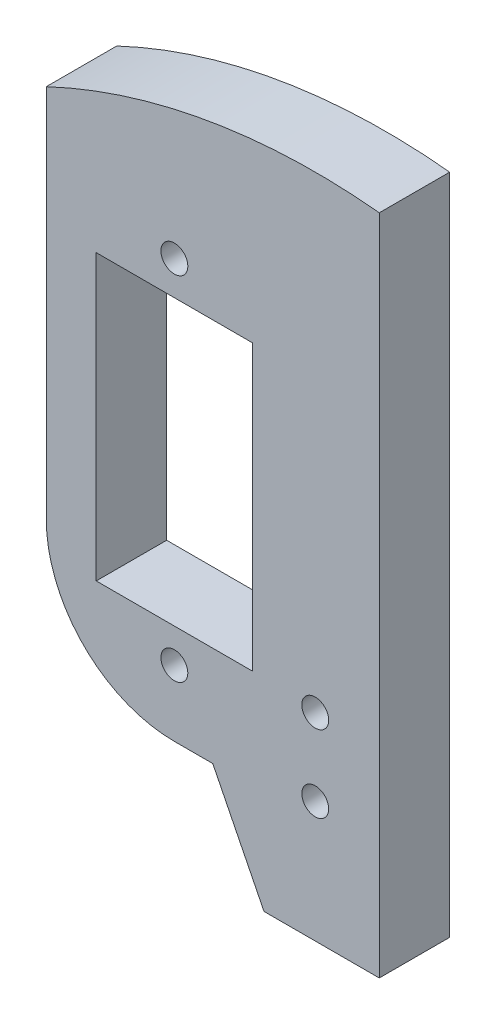
ISO-10303-21;
HEADER;
FILE_DESCRIPTION(('STEP AP214'),'2;1');
FILE_NAME('part.step','',(''),(''),'','','');
FILE_SCHEMA(('AUTOMOTIVE_DESIGN { 1 0 10303 214 1 1 1 1 }'));
ENDSEC;
DATA;
#1=APPLICATION_CONTEXT('core data for automotive mechanical design processes');
#2=APPLICATION_PROTOCOL_DEFINITION('international standard','automotive_design',2000,#1);
#3=PRODUCT_CONTEXT('',#1,'mechanical');
#4=PRODUCT('Part','Part','',(#3));
#5=PRODUCT_RELATED_PRODUCT_CATEGORY('part','',(#4));
#6=PRODUCT_DEFINITION_FORMATION('','',#4);
#7=PRODUCT_DEFINITION_CONTEXT('part definition',#1,'design');
#8=PRODUCT_DEFINITION('design','',#6,#7);
#9=PRODUCT_DEFINITION_SHAPE('','',#8);
#10=(LENGTH_UNIT() NAMED_UNIT(*) SI_UNIT(.MILLI.,.METRE.));
#11=(NAMED_UNIT(*) PLANE_ANGLE_UNIT() SI_UNIT($,.RADIAN.));
#12=(NAMED_UNIT(*) SI_UNIT($,.STERADIAN.) SOLID_ANGLE_UNIT());
#13=UNCERTAINTY_MEASURE_WITH_UNIT(LENGTH_MEASURE(1.E-05),#10,'distance_accuracy_value','');
#14=(GEOMETRIC_REPRESENTATION_CONTEXT(3) GLOBAL_UNCERTAINTY_ASSIGNED_CONTEXT((#13)) GLOBAL_UNIT_ASSIGNED_CONTEXT((#10,
#11,#12)) REPRESENTATION_CONTEXT('',''));
#15=CARTESIAN_POINT('',(0.,0.,0.));
#16=DIRECTION('',(0.,0.,1.));
#17=DIRECTION('',(1.,0.,0.));
#18=AXIS2_PLACEMENT_3D('',#15,#16,#17);
#19=CARTESIAN_POINT('',(0.,0.,5.5));
#20=DIRECTION('',(0.,0.,1.));
#21=DIRECTION('',(1.,0.,0.));
#22=AXIS2_PLACEMENT_3D('',#19,#20,#21);
#23=PLANE('',#22);
#24=DIRECTION('',(0.,-1.,0.));
#25=VECTOR('',#24,1.);
#26=CARTESIAN_POINT('',(-10.,26.1,5.5));
#27=LINE('',#26,#25);
#28=CARTESIAN_POINT('',(-10.,20.3718872423573,5.5));
#29=VERTEX_POINT('',#28);
#30=CARTESIAN_POINT('',(-10.,-8.89999999999999,5.5));
#31=VERTEX_POINT('',#30);
#32=EDGE_CURVE('E139',#29,#31,#27,.T.);
#33=ORIENTED_EDGE('',*,*,#32,.T.);
#34=CARTESIAN_POINT('',(0.,-8.9,5.5));
#35=DIRECTION('',(0.,0.,1.));
#36=DIRECTION('',(1.,0.,0.));
#37=AXIS2_PLACEMENT_3D('',#34,#35,#36);
#38=CIRCLE('',#37,10.);
#39=CARTESIAN_POINT('',(0.,-18.9,5.5));
#40=VERTEX_POINT('',#39);
#41=EDGE_CURVE('E11',#31,#40,#38,.T.);
#42=ORIENTED_EDGE('',*,*,#41,.T.);
#43=DIRECTION('',(1.,0.,0.));
#44=VECTOR('',#43,1.);
#45=CARTESIAN_POINT('',(-10.,-18.9,5.5));
#46=LINE('',#45,#44);
#47=CARTESIAN_POINT('',(3.,-18.9,5.5));
#48=VERTEX_POINT('',#47);
#49=EDGE_CURVE('E142',#40,#48,#46,.T.);
#50=ORIENTED_EDGE('',*,*,#49,.T.);
#51=DIRECTION('',(0.447213595499959,-0.894427190999916,0.));
#52=VECTOR('',#51,1.);
#53=CARTESIAN_POINT('',(3.,-18.9,5.5));
#54=LINE('',#53,#52);
#55=CARTESIAN_POINT('',(7.00000000000001,-26.9,5.5));
#56=VERTEX_POINT('',#55);
#57=EDGE_CURVE('E175',#48,#56,#54,.T.);
#58=ORIENTED_EDGE('',*,*,#57,.T.);
#59=DIRECTION('',(1.,0.,0.));
#60=VECTOR('',#59,1.);
#61=CARTESIAN_POINT('',(7.00000000000001,-26.9,5.5));
#62=LINE('',#61,#60);
#63=CARTESIAN_POINT('',(16.,-26.9,5.5));
#64=VERTEX_POINT('',#63);
#65=EDGE_CURVE('E173',#56,#64,#62,.T.);
#66=ORIENTED_EDGE('',*,*,#65,.T.);
#67=DIRECTION('',(0.,1.,0.));
#68=VECTOR('',#67,1.);
#69=CARTESIAN_POINT('',(16.,26.1,5.5));
#70=LINE('',#69,#68);
#71=CARTESIAN_POINT('',(16.,24.8442304278158,5.5));
#72=VERTEX_POINT('',#71);
#73=EDGE_CURVE('E150',#64,#72,#70,.T.);
#74=ORIENTED_EDGE('',*,*,#73,.T.);
#75=CARTESIAN_POINT('',(11.,-23.9,5.5));
#76=DIRECTION('',(0.,0.,-1.));
#77=DIRECTION('',(-1.,0.,0.));
#78=AXIS2_PLACEMENT_3D('',#75,#76,#77);
#79=CIRCLE('',#78,49.);
#80=EDGE_CURVE('E121',#29,#72,#79,.T.);
#81=ORIENTED_EDGE('',*,*,#80,.F.);
#82=EDGE_LOOP('',(#33,#42,#50,#58,#66,#74,#81));
#83=FACE_BOUND('',#82,.T.);
#84=CARTESIAN_POINT('',(11.,-11.45,5.5));
#85=DIRECTION('',(0.,0.,1.));
#86=DIRECTION('',(1.,0.,0.));
#87=AXIS2_PLACEMENT_3D('',#84,#85,#86);
#88=CIRCLE('',#87,1.05);
#89=CARTESIAN_POINT('',(12.05,-11.45,5.5));
#90=VERTEX_POINT('',#89);
#91=EDGE_CURVE('E218',#90,#90,#88,.T.);
#92=ORIENTED_EDGE('',*,*,#91,.F.);
#93=EDGE_LOOP('',(#92));
#94=FACE_BOUND('',#93,.T.);
#95=CARTESIAN_POINT('',(0.,-13.75,5.5));
#96=DIRECTION('',(0.,0.,1.));
#97=DIRECTION('',(1.,0.,0.));
#98=AXIS2_PLACEMENT_3D('',#95,#96,#97);
#99=CIRCLE('',#98,1.05);
#100=CARTESIAN_POINT('',(1.05,-13.75,5.5));
#101=VERTEX_POINT('',#100);
#102=EDGE_CURVE('E201',#101,#101,#99,.T.);
#103=ORIENTED_EDGE('',*,*,#102,.F.);
#104=EDGE_LOOP('',(#103));
#105=FACE_BOUND('',#104,.T.);
#106=DIRECTION('',(1.,0.,0.));
#107=VECTOR('',#106,1.);
#108=CARTESIAN_POINT('',(6.1,-11.1,5.5));
#109=LINE('',#108,#107);
#110=CARTESIAN_POINT('',(-6.1,-11.1,5.5));
#111=VERTEX_POINT('',#110);
#112=CARTESIAN_POINT('',(6.1,-11.1,5.5));
#113=VERTEX_POINT('',#112);
#114=EDGE_CURVE('E206',#111,#113,#109,.T.);
#115=ORIENTED_EDGE('',*,*,#114,.F.);
#116=DIRECTION('',(0.,-1.,0.));
#117=VECTOR('',#116,1.);
#118=CARTESIAN_POINT('',(-6.1,11.1,5.5));
#119=LINE('',#118,#117);
#120=CARTESIAN_POINT('',(-6.1,11.1,5.5));
#121=VERTEX_POINT('',#120);
#122=EDGE_CURVE('E191',#121,#111,#119,.T.);
#123=ORIENTED_EDGE('',*,*,#122,.F.);
#124=DIRECTION('',(-1.,0.,0.));
#125=VECTOR('',#124,1.);
#126=CARTESIAN_POINT('',(6.1,11.1,5.5));
#127=LINE('',#126,#125);
#128=CARTESIAN_POINT('',(6.1,11.1,5.5));
#129=VERTEX_POINT('',#128);
#130=EDGE_CURVE('E187',#129,#121,#127,.T.);
#131=ORIENTED_EDGE('',*,*,#130,.F.);
#132=DIRECTION('',(0.,1.,0.));
#133=VECTOR('',#132,1.);
#134=CARTESIAN_POINT('',(6.1,11.1,5.5));
#135=LINE('',#134,#133);
#136=EDGE_CURVE('E203',#113,#129,#135,.T.);
#137=ORIENTED_EDGE('',*,*,#136,.F.);
#138=EDGE_LOOP('',(#115,#123,#131,#137));
#139=FACE_BOUND('',#138,.T.);
#140=CARTESIAN_POINT('',(0.,13.75,5.5));
#141=DIRECTION('',(0.,0.,1.));
#142=DIRECTION('',(1.,0.,0.));
#143=AXIS2_PLACEMENT_3D('',#140,#141,#142);
#144=CIRCLE('',#143,1.05);
#145=CARTESIAN_POINT('',(1.05,13.75,5.5));
#146=VERTEX_POINT('',#145);
#147=EDGE_CURVE('E212',#146,#146,#144,.T.);
#148=ORIENTED_EDGE('',*,*,#147,.F.);
#149=EDGE_LOOP('',(#148));
#150=FACE_BOUND('',#149,.T.);
#151=CARTESIAN_POINT('',(11.,-17.45,5.5));
#152=DIRECTION('',(0.,0.,1.));
#153=DIRECTION('',(1.,0.,0.));
#154=AXIS2_PLACEMENT_3D('',#151,#152,#153);
#155=CIRCLE('',#154,1.05);
#156=CARTESIAN_POINT('',(12.05,-17.45,5.5));
#157=VERTEX_POINT('',#156);
#158=EDGE_CURVE('E224',#157,#157,#155,.T.);
#159=ORIENTED_EDGE('',*,*,#158,.F.);
#160=EDGE_LOOP('',(#159));
#161=FACE_BOUND('',#160,.T.);
#162=ADVANCED_FACE('F33',(#83,#94,#105,#139,#150,#161),#23,.T.);
#163=CARTESIAN_POINT('',(0.,0.,0.));
#164=DIRECTION('',(0.,0.,1.));
#165=DIRECTION('',(1.,0.,0.));
#166=AXIS2_PLACEMENT_3D('',#163,#164,#165);
#167=PLANE('',#166);
#168=DIRECTION('',(1.,0.,0.));
#169=VECTOR('',#168,1.);
#170=CARTESIAN_POINT('',(-10.,-18.9,0.));
#171=LINE('',#170,#169);
#172=CARTESIAN_POINT('',(0.,-18.9,0.));
#173=VERTEX_POINT('',#172);
#174=CARTESIAN_POINT('',(3.,-18.9,0.));
#175=VERTEX_POINT('',#174);
#176=EDGE_CURVE('E164',#173,#175,#171,.T.);
#177=ORIENTED_EDGE('',*,*,#176,.F.);
#178=CARTESIAN_POINT('',(0.,-8.9,0.));
#179=DIRECTION('',(0.,0.,1.));
#180=DIRECTION('',(1.,0.,0.));
#181=AXIS2_PLACEMENT_3D('',#178,#179,#180);
#182=CIRCLE('',#181,10.);
#183=CARTESIAN_POINT('',(-10.,-8.89999999999999,0.));
#184=VERTEX_POINT('',#183);
#185=EDGE_CURVE('E55',#173,#184,#182,.F.);
#186=ORIENTED_EDGE('',*,*,#185,.T.);
#187=DIRECTION('',(0.,-1.,0.));
#188=VECTOR('',#187,1.);
#189=CARTESIAN_POINT('',(-10.,26.1,0.));
#190=LINE('',#189,#188);
#191=CARTESIAN_POINT('',(-10.,20.3718872423573,0.));
#192=VERTEX_POINT('',#191);
#193=EDGE_CURVE('E133',#192,#184,#190,.T.);
#194=ORIENTED_EDGE('',*,*,#193,.F.);
#195=CARTESIAN_POINT('',(11.,-23.9,0.));
#196=DIRECTION('',(0.,0.,-1.));
#197=DIRECTION('',(-1.,0.,0.));
#198=AXIS2_PLACEMENT_3D('',#195,#196,#197);
#199=CIRCLE('',#198,49.);
#200=CARTESIAN_POINT('',(16.,24.8442304278158,0.));
#201=VERTEX_POINT('',#200);
#202=EDGE_CURVE('E118',#192,#201,#199,.T.);
#203=ORIENTED_EDGE('',*,*,#202,.T.);
#204=DIRECTION('',(0.,1.,0.));
#205=VECTOR('',#204,1.);
#206=CARTESIAN_POINT('',(16.,26.1,0.));
#207=LINE('',#206,#205);
#208=CARTESIAN_POINT('',(16.,-26.9,0.));
#209=VERTEX_POINT('',#208);
#210=EDGE_CURVE('E132',#209,#201,#207,.T.);
#211=ORIENTED_EDGE('',*,*,#210,.F.);
#212=DIRECTION('',(1.,0.,0.));
#213=VECTOR('',#212,1.);
#214=CARTESIAN_POINT('',(7.00000000000001,-26.9,0.));
#215=LINE('',#214,#213);
#216=CARTESIAN_POINT('',(7.00000000000001,-26.9,0.));
#217=VERTEX_POINT('',#216);
#218=EDGE_CURVE('E140',#217,#209,#215,.T.);
#219=ORIENTED_EDGE('',*,*,#218,.F.);
#220=DIRECTION('',(0.447213595499959,-0.894427190999916,0.));
#221=VECTOR('',#220,1.);
#222=CARTESIAN_POINT('',(3.,-18.9,0.));
#223=LINE('',#222,#221);
#224=EDGE_CURVE('E144',#175,#217,#223,.T.);
#225=ORIENTED_EDGE('',*,*,#224,.F.);
#226=EDGE_LOOP('',(#177,#186,#194,#203,#211,#219,#225));
#227=FACE_BOUND('',#226,.T.);
#228=DIRECTION('',(0.,-1.,0.));
#229=VECTOR('',#228,1.);
#230=CARTESIAN_POINT('',(-6.1,11.1,0.));
#231=LINE('',#230,#229);
#232=CARTESIAN_POINT('',(-6.1,11.1,0.));
#233=VERTEX_POINT('',#232);
#234=CARTESIAN_POINT('',(-6.1,-11.1,0.));
#235=VERTEX_POINT('',#234);
#236=EDGE_CURVE('E198',#233,#235,#231,.T.);
#237=ORIENTED_EDGE('',*,*,#236,.T.);
#238=DIRECTION('',(1.,0.,0.));
#239=VECTOR('',#238,1.);
#240=CARTESIAN_POINT('',(6.1,-11.1,0.));
#241=LINE('',#240,#239);
#242=CARTESIAN_POINT('',(6.1,-11.1,0.));
#243=VERTEX_POINT('',#242);
#244=EDGE_CURVE('E195',#235,#243,#241,.T.);
#245=ORIENTED_EDGE('',*,*,#244,.T.);
#246=DIRECTION('',(0.,1.,0.));
#247=VECTOR('',#246,1.);
#248=CARTESIAN_POINT('',(6.1,11.1,0.));
#249=LINE('',#248,#247);
#250=CARTESIAN_POINT('',(6.1,11.1,0.));
#251=VERTEX_POINT('',#250);
#252=EDGE_CURVE('E192',#243,#251,#249,.T.);
#253=ORIENTED_EDGE('',*,*,#252,.T.);
#254=DIRECTION('',(-1.,0.,0.));
#255=VECTOR('',#254,1.);
#256=CARTESIAN_POINT('',(6.1,11.1,0.));
#257=LINE('',#256,#255);
#258=EDGE_CURVE('E188',#251,#233,#257,.T.);
#259=ORIENTED_EDGE('',*,*,#258,.T.);
#260=EDGE_LOOP('',(#237,#245,#253,#259));
#261=FACE_BOUND('',#260,.T.);
#262=CARTESIAN_POINT('',(0.,-13.75,0.));
#263=DIRECTION('',(0.,0.,1.));
#264=DIRECTION('',(1.,0.,0.));
#265=AXIS2_PLACEMENT_3D('',#262,#263,#264);
#266=CIRCLE('',#265,1.05);
#267=CARTESIAN_POINT('',(1.05,-13.75,0.));
#268=VERTEX_POINT('',#267);
#269=EDGE_CURVE('E209',#268,#268,#266,.T.);
#270=ORIENTED_EDGE('',*,*,#269,.T.);
#271=EDGE_LOOP('',(#270));
#272=FACE_BOUND('',#271,.T.);
#273=CARTESIAN_POINT('',(0.,13.75,0.));
#274=DIRECTION('',(0.,0.,1.));
#275=DIRECTION('',(1.,0.,0.));
#276=AXIS2_PLACEMENT_3D('',#273,#274,#275);
#277=CIRCLE('',#276,1.05);
#278=CARTESIAN_POINT('',(1.05,13.75,0.));
#279=VERTEX_POINT('',#278);
#280=EDGE_CURVE('E215',#279,#279,#277,.T.);
#281=ORIENTED_EDGE('',*,*,#280,.T.);
#282=EDGE_LOOP('',(#281));
#283=FACE_BOUND('',#282,.T.);
#284=CARTESIAN_POINT('',(11.,-11.45,0.));
#285=DIRECTION('',(0.,0.,1.));
#286=DIRECTION('',(1.,0.,0.));
#287=AXIS2_PLACEMENT_3D('',#284,#285,#286);
#288=CIRCLE('',#287,1.05);
#289=CARTESIAN_POINT('',(12.05,-11.45,0.));
#290=VERTEX_POINT('',#289);
#291=EDGE_CURVE('E221',#290,#290,#288,.T.);
#292=ORIENTED_EDGE('',*,*,#291,.T.);
#293=EDGE_LOOP('',(#292));
#294=FACE_BOUND('',#293,.T.);
#295=CARTESIAN_POINT('',(11.,-17.45,0.));
#296=DIRECTION('',(0.,0.,1.));
#297=DIRECTION('',(1.,0.,0.));
#298=AXIS2_PLACEMENT_3D('',#295,#296,#297);
#299=CIRCLE('',#298,1.05);
#300=CARTESIAN_POINT('',(12.05,-17.45,0.));
#301=VERTEX_POINT('',#300);
#302=EDGE_CURVE('E227',#301,#301,#299,.T.);
#303=ORIENTED_EDGE('',*,*,#302,.T.);
#304=EDGE_LOOP('',(#303));
#305=FACE_BOUND('',#304,.T.);
#306=ADVANCED_FACE('F129',(#227,#261,#272,#283,#294,#305),#167,.F.);
#307=CARTESIAN_POINT('',(-10.,26.1,5.5));
#308=DIRECTION('',(1.,0.,0.));
#309=DIRECTION('',(0.,1.,0.));
#310=AXIS2_PLACEMENT_3D('',#307,#308,#309);
#311=PLANE('',#310);
#312=ORIENTED_EDGE('',*,*,#193,.T.);
#313=DIRECTION('',(0.,0.,-1.));
#314=VECTOR('',#313,1.);
#315=CARTESIAN_POINT('',(-10.,-8.9,5.5));
#316=LINE('',#315,#314);
#317=EDGE_CURVE('E41',#184,#31,#316,.F.);
#318=ORIENTED_EDGE('',*,*,#317,.T.);
#319=ORIENTED_EDGE('',*,*,#32,.F.);
#320=DIRECTION('',(0.,0.,1.));
#321=VECTOR('',#320,1.);
#322=CARTESIAN_POINT('',(-10.,20.3718872423573,0.));
#323=LINE('',#322,#321);
#324=EDGE_CURVE('E126',#192,#29,#323,.T.);
#325=ORIENTED_EDGE('',*,*,#324,.F.);
#326=EDGE_LOOP('',(#312,#318,#319,#325));
#327=FACE_BOUND('',#326,.T.);
#328=ADVANCED_FACE('F235',(#327),#311,.F.);
#329=CARTESIAN_POINT('',(-10.,-18.9,5.5));
#330=DIRECTION('',(0.,1.,0.));
#331=DIRECTION('',(0.,0.,1.));
#332=AXIS2_PLACEMENT_3D('',#329,#330,#331);
#333=PLANE('',#332);
#334=ORIENTED_EDGE('',*,*,#49,.F.);
#335=DIRECTION('',(0.,0.,-1.));
#336=VECTOR('',#335,1.);
#337=CARTESIAN_POINT('',(0.,-18.9,5.5));
#338=LINE('',#337,#336);
#339=EDGE_CURVE('E156',#40,#173,#338,.T.);
#340=ORIENTED_EDGE('',*,*,#339,.T.);
#341=ORIENTED_EDGE('',*,*,#176,.T.);
#342=DIRECTION('',(0.,0.,-1.));
#343=VECTOR('',#342,1.);
#344=CARTESIAN_POINT('',(3.,-18.9,5.5));
#345=LINE('',#344,#343);
#346=EDGE_CURVE('E153',#48,#175,#345,.T.);
#347=ORIENTED_EDGE('',*,*,#346,.F.);
#348=EDGE_LOOP('',(#334,#340,#341,#347));
#349=FACE_BOUND('',#348,.T.);
#350=ADVANCED_FACE('F162',(#349),#333,.F.);
#351=CARTESIAN_POINT('',(3.,-18.9,5.5));
#352=DIRECTION('',(0.894427190999916,0.447213595499959,0.));
#353=DIRECTION('',(-0.447213595499959,0.894427190999916,0.));
#354=AXIS2_PLACEMENT_3D('',#351,#352,#353);
#355=PLANE('',#354);
#356=ORIENTED_EDGE('',*,*,#224,.T.);
#357=DIRECTION('',(0.,0.,-1.));
#358=VECTOR('',#357,1.);
#359=CARTESIAN_POINT('',(7.00000000000001,-26.9,5.5));
#360=LINE('',#359,#358);
#361=EDGE_CURVE('E149',#56,#217,#360,.T.);
#362=ORIENTED_EDGE('',*,*,#361,.F.);
#363=ORIENTED_EDGE('',*,*,#57,.F.);
#364=ORIENTED_EDGE('',*,*,#346,.T.);
#365=EDGE_LOOP('',(#356,#362,#363,#364));
#366=FACE_BOUND('',#365,.T.);
#367=ADVANCED_FACE('F241',(#366),#355,.F.);
#368=CARTESIAN_POINT('',(7.00000000000001,-26.9,5.5));
#369=DIRECTION('',(0.,1.,0.));
#370=DIRECTION('',(0.,0.,1.));
#371=AXIS2_PLACEMENT_3D('',#368,#369,#370);
#372=PLANE('',#371);
#373=ORIENTED_EDGE('',*,*,#218,.T.);
#374=DIRECTION('',(0.,0.,-1.));
#375=VECTOR('',#374,1.);
#376=CARTESIAN_POINT('',(16.,-26.9,5.5));
#377=LINE('',#376,#375);
#378=EDGE_CURVE('E138',#64,#209,#377,.T.);
#379=ORIENTED_EDGE('',*,*,#378,.F.);
#380=ORIENTED_EDGE('',*,*,#65,.F.);
#381=ORIENTED_EDGE('',*,*,#361,.T.);
#382=EDGE_LOOP('',(#373,#379,#380,#381));
#383=FACE_BOUND('',#382,.T.);
#384=ADVANCED_FACE('F255',(#383),#372,.F.);
#385=CARTESIAN_POINT('',(16.,26.1,5.5));
#386=DIRECTION('',(-1.,0.,0.));
#387=DIRECTION('',(0.,-1.,0.));
#388=AXIS2_PLACEMENT_3D('',#385,#386,#387);
#389=PLANE('',#388);
#390=ORIENTED_EDGE('',*,*,#210,.T.);
#391=DIRECTION('',(0.,0.,1.));
#392=VECTOR('',#391,1.);
#393=CARTESIAN_POINT('',(16.,24.8442304278158,0.));
#394=LINE('',#393,#392);
#395=EDGE_CURVE('E115',#201,#72,#394,.T.);
#396=ORIENTED_EDGE('',*,*,#395,.T.);
#397=ORIENTED_EDGE('',*,*,#73,.F.);
#398=ORIENTED_EDGE('',*,*,#378,.T.);
#399=EDGE_LOOP('',(#390,#396,#397,#398));
#400=FACE_BOUND('',#399,.T.);
#401=ADVANCED_FACE('F136',(#400),#389,.F.);
#402=CARTESIAN_POINT('',(-6.1,11.1,5.5));
#403=DIRECTION('',(1.,0.,0.));
#404=DIRECTION('',(0.,1.,0.));
#405=AXIS2_PLACEMENT_3D('',#402,#403,#404);
#406=PLANE('',#405);
#407=ORIENTED_EDGE('',*,*,#236,.F.);
#408=DIRECTION('',(0.,0.,-1.));
#409=VECTOR('',#408,1.);
#410=CARTESIAN_POINT('',(-6.1,11.1,5.5));
#411=LINE('',#410,#409);
#412=EDGE_CURVE('E184',#121,#233,#411,.T.);
#413=ORIENTED_EDGE('',*,*,#412,.F.);
#414=ORIENTED_EDGE('',*,*,#122,.T.);
#415=DIRECTION('',(0.,0.,-1.));
#416=VECTOR('',#415,1.);
#417=CARTESIAN_POINT('',(-6.1,-11.1,5.5));
#418=LINE('',#417,#416);
#419=EDGE_CURVE('E169',#111,#235,#418,.T.);
#420=ORIENTED_EDGE('',*,*,#419,.T.);
#421=EDGE_LOOP('',(#407,#413,#414,#420));
#422=FACE_BOUND('',#421,.T.);
#423=ADVANCED_FACE('F250',(#422),#406,.T.);
#424=CARTESIAN_POINT('',(6.1,-11.1,5.5));
#425=DIRECTION('',(0.,1.,0.));
#426=DIRECTION('',(0.,0.,1.));
#427=AXIS2_PLACEMENT_3D('',#424,#425,#426);
#428=PLANE('',#427);
#429=ORIENTED_EDGE('',*,*,#244,.F.);
#430=ORIENTED_EDGE('',*,*,#419,.F.);
#431=ORIENTED_EDGE('',*,*,#114,.T.);
#432=DIRECTION('',(0.,0.,-1.));
#433=VECTOR('',#432,1.);
#434=CARTESIAN_POINT('',(6.1,-11.1,5.5));
#435=LINE('',#434,#433);
#436=EDGE_CURVE('E180',#113,#243,#435,.T.);
#437=ORIENTED_EDGE('',*,*,#436,.T.);
#438=EDGE_LOOP('',(#429,#430,#431,#437));
#439=FACE_BOUND('',#438,.T.);
#440=ADVANCED_FACE('F296',(#439),#428,.T.);
#441=CARTESIAN_POINT('',(6.1,11.1,5.5));
#442=DIRECTION('',(-1.,0.,0.));
#443=DIRECTION('',(0.,-1.,0.));
#444=AXIS2_PLACEMENT_3D('',#441,#442,#443);
#445=PLANE('',#444);
#446=ORIENTED_EDGE('',*,*,#252,.F.);
#447=ORIENTED_EDGE('',*,*,#436,.F.);
#448=ORIENTED_EDGE('',*,*,#136,.T.);
#449=DIRECTION('',(0.,0.,-1.));
#450=VECTOR('',#449,1.);
#451=CARTESIAN_POINT('',(6.1,11.1,5.5));
#452=LINE('',#451,#450);
#453=EDGE_CURVE('E182',#129,#251,#452,.T.);
#454=ORIENTED_EDGE('',*,*,#453,.T.);
#455=EDGE_LOOP('',(#446,#447,#448,#454));
#456=FACE_BOUND('',#455,.T.);
#457=ADVANCED_FACE('F293',(#456),#445,.T.);
#458=CARTESIAN_POINT('',(6.1,11.1,5.5));
#459=DIRECTION('',(0.,-1.,0.));
#460=DIRECTION('',(0.,0.,-1.));
#461=AXIS2_PLACEMENT_3D('',#458,#459,#460);
#462=PLANE('',#461);
#463=ORIENTED_EDGE('',*,*,#258,.F.);
#464=ORIENTED_EDGE('',*,*,#453,.F.);
#465=ORIENTED_EDGE('',*,*,#130,.T.);
#466=ORIENTED_EDGE('',*,*,#412,.T.);
#467=EDGE_LOOP('',(#463,#464,#465,#466));
#468=FACE_BOUND('',#467,.T.);
#469=ADVANCED_FACE('F289',(#468),#462,.T.);
#470=CARTESIAN_POINT('',(0.,-13.75,5.5));
#471=DIRECTION('',(0.,0.,-1.));
#472=DIRECTION('',(-1.,0.,0.));
#473=AXIS2_PLACEMENT_3D('',#470,#471,#472);
#474=CYLINDRICAL_SURFACE('',#473,1.05);
#475=ORIENTED_EDGE('',*,*,#102,.T.);
#476=EDGE_LOOP('',(#475));
#477=FACE_BOUND('',#476,.T.);
#478=ORIENTED_EDGE('',*,*,#269,.F.);
#479=EDGE_LOOP('',(#478));
#480=FACE_BOUND('',#479,.T.);
#481=ADVANCED_FACE('F285',(#477,#480),#474,.F.);
#482=CARTESIAN_POINT('',(0.,13.75,5.5));
#483=DIRECTION('',(0.,0.,-1.));
#484=DIRECTION('',(-1.,0.,0.));
#485=AXIS2_PLACEMENT_3D('',#482,#483,#484);
#486=CYLINDRICAL_SURFACE('',#485,1.05);
#487=ORIENTED_EDGE('',*,*,#147,.T.);
#488=EDGE_LOOP('',(#487));
#489=FACE_BOUND('',#488,.T.);
#490=ORIENTED_EDGE('',*,*,#280,.F.);
#491=EDGE_LOOP('',(#490));
#492=FACE_BOUND('',#491,.T.);
#493=ADVANCED_FACE('F281',(#489,#492),#486,.F.);
#494=CARTESIAN_POINT('',(11.,-11.45,5.5));
#495=DIRECTION('',(0.,0.,-1.));
#496=DIRECTION('',(-1.,0.,0.));
#497=AXIS2_PLACEMENT_3D('',#494,#495,#496);
#498=CYLINDRICAL_SURFACE('',#497,1.05);
#499=ORIENTED_EDGE('',*,*,#91,.T.);
#500=EDGE_LOOP('',(#499));
#501=FACE_BOUND('',#500,.T.);
#502=ORIENTED_EDGE('',*,*,#291,.F.);
#503=EDGE_LOOP('',(#502));
#504=FACE_BOUND('',#503,.T.);
#505=ADVANCED_FACE('F275',(#501,#504),#498,.F.);
#506=CARTESIAN_POINT('',(11.,-17.45,5.5));
#507=DIRECTION('',(0.,0.,-1.));
#508=DIRECTION('',(-1.,0.,0.));
#509=AXIS2_PLACEMENT_3D('',#506,#507,#508);
#510=CYLINDRICAL_SURFACE('',#509,1.05);
#511=ORIENTED_EDGE('',*,*,#158,.T.);
#512=EDGE_LOOP('',(#511));
#513=FACE_BOUND('',#512,.T.);
#514=ORIENTED_EDGE('',*,*,#302,.F.);
#515=EDGE_LOOP('',(#514));
#516=FACE_BOUND('',#515,.T.);
#517=ADVANCED_FACE('F271',(#513,#516),#510,.F.);
#518=CARTESIAN_POINT('',(11.,-23.9,0.));
#519=DIRECTION('',(0.,0.,1.));
#520=DIRECTION('',(1.,0.,0.));
#521=AXIS2_PLACEMENT_3D('',#518,#519,#520);
#522=CYLINDRICAL_SURFACE('',#521,49.);
#523=ORIENTED_EDGE('',*,*,#80,.T.);
#524=ORIENTED_EDGE('',*,*,#395,.F.);
#525=ORIENTED_EDGE('',*,*,#202,.F.);
#526=ORIENTED_EDGE('',*,*,#324,.T.);
#527=EDGE_LOOP('',(#523,#524,#525,#526));
#528=FACE_BOUND('',#527,.T.);
#529=ADVANCED_FACE('F117',(#528),#522,.T.);
#530=CARTESIAN_POINT('',(0.,-8.9,5.5));
#531=DIRECTION('',(0.,0.,-1.));
#532=DIRECTION('',(-1.,0.,0.));
#533=AXIS2_PLACEMENT_3D('',#530,#531,#532);
#534=CYLINDRICAL_SURFACE('',#533,10.);
#535=ORIENTED_EDGE('',*,*,#41,.F.);
#536=ORIENTED_EDGE('',*,*,#317,.F.);
#537=ORIENTED_EDGE('',*,*,#185,.F.);
#538=ORIENTED_EDGE('',*,*,#339,.F.);
#539=EDGE_LOOP('',(#535,#536,#537,#538));
#540=FACE_BOUND('',#539,.T.);
#541=ADVANCED_FACE('F35',(#540),#534,.T.);
#542=CLOSED_SHELL('',(#162,#306,#328,#350,#367,#384,#401,#423,#440,#457,#469,#481,#493,#505,
#517,#529,#541));
#543=MANIFOLD_SOLID_BREP('B2',#542);
#544=ADVANCED_BREP_SHAPE_REPRESENTATION('',(#18,#543),#14);
#545=SHAPE_DEFINITION_REPRESENTATION(#9,#544);
ENDSEC;
END-ISO-10303-21;
